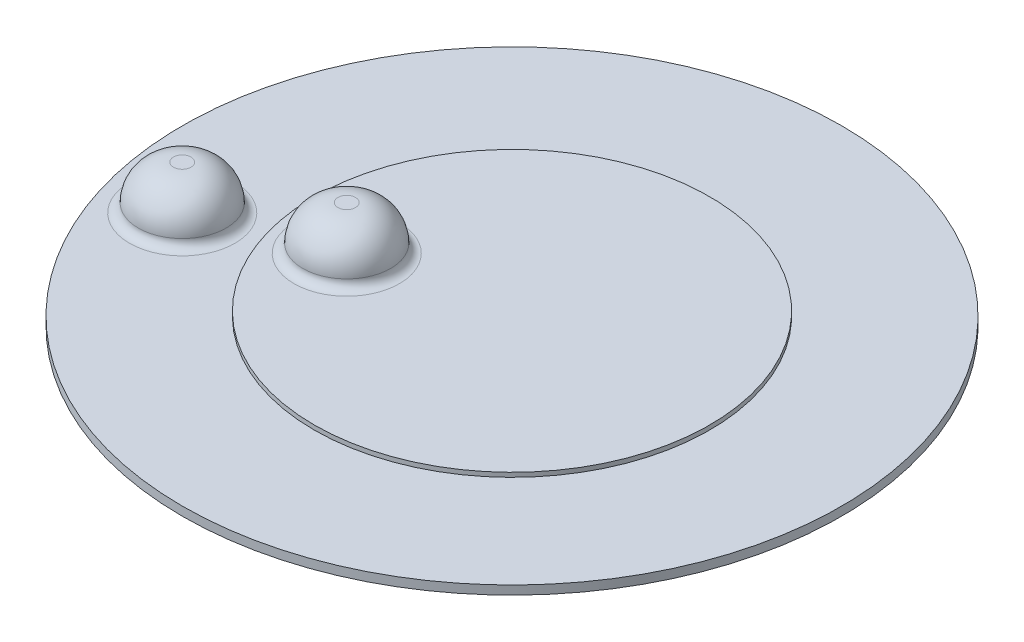
ISO-10303-21;
HEADER;
FILE_DESCRIPTION(('STEP AP214'),'2;1');
FILE_NAME('part.step','',(''),(''),'','','');
FILE_SCHEMA(('AUTOMOTIVE_DESIGN { 1 0 10303 214 1 1 1 1 }'));
ENDSEC;
DATA;
#1=APPLICATION_CONTEXT('core data for automotive mechanical design processes');
#2=APPLICATION_PROTOCOL_DEFINITION('international standard','automotive_design',2000,#1);
#3=PRODUCT_CONTEXT('',#1,'mechanical');
#4=PRODUCT('Part','Part','',(#3));
#5=PRODUCT_RELATED_PRODUCT_CATEGORY('part','',(#4));
#6=PRODUCT_DEFINITION_FORMATION('','',#4);
#7=PRODUCT_DEFINITION_CONTEXT('part definition',#1,'design');
#8=PRODUCT_DEFINITION('design','',#6,#7);
#9=PRODUCT_DEFINITION_SHAPE('','',#8);
#10=(LENGTH_UNIT() NAMED_UNIT(*) SI_UNIT(.MILLI.,.METRE.));
#11=(NAMED_UNIT(*) PLANE_ANGLE_UNIT() SI_UNIT($,.RADIAN.));
#12=(NAMED_UNIT(*) SI_UNIT($,.STERADIAN.) SOLID_ANGLE_UNIT());
#13=UNCERTAINTY_MEASURE_WITH_UNIT(LENGTH_MEASURE(1.E-05),#10,'distance_accuracy_value','');
#14=(GEOMETRIC_REPRESENTATION_CONTEXT(3) GLOBAL_UNCERTAINTY_ASSIGNED_CONTEXT((#13)) GLOBAL_UNIT_ASSIGNED_CONTEXT((#10,
#11,#12)) REPRESENTATION_CONTEXT('',''));
#15=CARTESIAN_POINT('',(0.,0.,0.));
#16=DIRECTION('',(0.,0.,1.));
#17=DIRECTION('',(1.,0.,0.));
#18=AXIS2_PLACEMENT_3D('',#15,#16,#17);
#19=CARTESIAN_POINT('',(0.,0.2,0.));
#20=DIRECTION('',(0.,-1.,0.));
#21=DIRECTION('',(0.,0.,-1.));
#22=AXIS2_PLACEMENT_3D('',#19,#20,#21);
#23=CYLINDRICAL_SURFACE('',#22,7.5);
#24=CARTESIAN_POINT('',(0.,0.2,0.));
#25=DIRECTION('',(0.,1.,0.));
#26=DIRECTION('',(0.,0.,1.));
#27=AXIS2_PLACEMENT_3D('',#24,#25,#26);
#28=CIRCLE('',#27,7.5);
#29=CARTESIAN_POINT('',(0.,0.2,7.5));
#30=VERTEX_POINT('',#29);
#31=EDGE_CURVE('E63',#30,#30,#28,.T.);
#32=ORIENTED_EDGE('',*,*,#31,.F.);
#33=EDGE_LOOP('',(#32));
#34=FACE_BOUND('',#33,.T.);
#35=CARTESIAN_POINT('',(0.,0.,0.));
#36=DIRECTION('',(0.,1.,0.));
#37=DIRECTION('',(0.,0.,1.));
#38=AXIS2_PLACEMENT_3D('',#35,#36,#37);
#39=CIRCLE('',#38,7.5);
#40=CARTESIAN_POINT('',(0.,0.,7.5));
#41=VERTEX_POINT('',#40);
#42=EDGE_CURVE('E60',#41,#41,#39,.T.);
#43=ORIENTED_EDGE('',*,*,#42,.T.);
#44=EDGE_LOOP('',(#43));
#45=FACE_BOUND('',#44,.T.);
#46=ADVANCED_FACE('F33',(#34,#45),#23,.T.);
#47=CARTESIAN_POINT('',(0.,0.2,0.));
#48=DIRECTION('',(0.,1.,0.));
#49=DIRECTION('',(0.,0.,1.));
#50=AXIS2_PLACEMENT_3D('',#47,#48,#49);
#51=PLANE('',#50);
#52=CARTESIAN_POINT('',(-5.78398758039477,0.2,1.72100243956531));
#53=DIRECTION('',(0.,1.,0.));
#54=DIRECTION('',(0.,0.,1.));
#55=AXIS2_PLACEMENT_3D('',#52,#53,#54);
#56=CIRCLE('',#55,1.2);
#57=CARTESIAN_POINT('',(-5.78398758039477,0.2,2.92100243956531));
#58=VERTEX_POINT('',#57);
#59=EDGE_CURVE('E10',#58,#58,#56,.F.);
#60=ORIENTED_EDGE('',*,*,#59,.T.);
#61=EDGE_LOOP('',(#60));
#62=FACE_BOUND('',#61,.T.);
#63=CARTESIAN_POINT('',(0.,0.2,0.));
#64=DIRECTION('',(0.,1.,0.));
#65=DIRECTION('',(0.,0.,1.));
#66=AXIS2_PLACEMENT_3D('',#63,#64,#65);
#67=CIRCLE('',#66,4.5);
#68=CARTESIAN_POINT('',(0.,0.2,4.5));
#69=VERTEX_POINT('',#68);
#70=EDGE_CURVE('E59',#69,#69,#67,.T.);
#71=ORIENTED_EDGE('',*,*,#70,.F.);
#72=EDGE_LOOP('',(#71));
#73=FACE_BOUND('',#72,.T.);
#74=ORIENTED_EDGE('',*,*,#31,.T.);
#75=EDGE_LOOP('',(#74));
#76=FACE_BOUND('',#75,.T.);
#77=ADVANCED_FACE('F81',(#62,#73,#76),#51,.T.);
#78=CARTESIAN_POINT('',(0.,0.,0.));
#79=DIRECTION('',(0.,1.,0.));
#80=DIRECTION('',(0.,0.,1.));
#81=AXIS2_PLACEMENT_3D('',#78,#79,#80);
#82=PLANE('',#81);
#83=ORIENTED_EDGE('',*,*,#42,.F.);
#84=EDGE_LOOP('',(#83));
#85=FACE_BOUND('',#84,.T.);
#86=ADVANCED_FACE('F77',(#85),#82,.F.);
#87=CARTESIAN_POINT('',(0.,0.3,0.));
#88=DIRECTION('',(0.,-1.,0.));
#89=DIRECTION('',(0.,0.,-1.));
#90=AXIS2_PLACEMENT_3D('',#87,#88,#89);
#91=CYLINDRICAL_SURFACE('',#90,4.5);
#92=CARTESIAN_POINT('',(0.,0.3,0.));
#93=DIRECTION('',(0.,1.,0.));
#94=DIRECTION('',(0.,0.,1.));
#95=AXIS2_PLACEMENT_3D('',#92,#93,#94);
#96=CIRCLE('',#95,4.5);
#97=CARTESIAN_POINT('',(0.,0.3,4.5));
#98=VERTEX_POINT('',#97);
#99=EDGE_CURVE('E64',#98,#98,#96,.T.);
#100=ORIENTED_EDGE('',*,*,#99,.F.);
#101=EDGE_LOOP('',(#100));
#102=FACE_BOUND('',#101,.T.);
#103=ORIENTED_EDGE('',*,*,#70,.T.);
#104=EDGE_LOOP('',(#103));
#105=FACE_BOUND('',#104,.T.);
#106=ADVANCED_FACE('F74',(#102,#105),#91,.T.);
#107=CARTESIAN_POINT('',(0.,0.3,0.));
#108=DIRECTION('',(0.,1.,0.));
#109=DIRECTION('',(0.,0.,1.));
#110=AXIS2_PLACEMENT_3D('',#107,#108,#109);
#111=PLANE('',#110);
#112=CARTESIAN_POINT('',(-3.01618984253715,0.3,0.745176314038591));
#113=DIRECTION('',(0.,1.,0.));
#114=DIRECTION('',(0.,0.,1.));
#115=AXIS2_PLACEMENT_3D('',#112,#113,#114);
#116=CIRCLE('',#115,1.2);
#117=CARTESIAN_POINT('',(-3.01618984253715,0.3,1.94517631403859));
#118=VERTEX_POINT('',#117);
#119=EDGE_CURVE('E40',#118,#118,#116,.F.);
#120=ORIENTED_EDGE('',*,*,#119,.T.);
#121=EDGE_LOOP('',(#120));
#122=FACE_BOUND('',#121,.T.);
#123=ORIENTED_EDGE('',*,*,#99,.T.);
#124=EDGE_LOOP('',(#123));
#125=FACE_BOUND('',#124,.T.);
#126=ADVANCED_FACE('F72',(#122,#125),#111,.T.);
#127=CARTESIAN_POINT('',(-5.78398758039477,1.2,1.72100243956531));
#128=DIRECTION('',(0.,1.,0.));
#129=DIRECTION('',(0.,0.,1.));
#130=AXIS2_PLACEMENT_3D('',#127,#128,#129);
#131=PLANE('',#130);
#132=CARTESIAN_POINT('',(-5.78398758039477,1.2,1.72100243956531));
#133=DIRECTION('',(0.,1.,0.));
#134=DIRECTION('',(0.,0.,1.));
#135=AXIS2_PLACEMENT_3D('',#132,#133,#134);
#136=CIRCLE('',#135,0.2);
#137=CARTESIAN_POINT('',(-5.78398758039477,1.2,1.92100243956531));
#138=VERTEX_POINT('',#137);
#139=EDGE_CURVE('E56',#138,#138,#136,.T.);
#140=ORIENTED_EDGE('',*,*,#139,.T.);
#141=EDGE_LOOP('',(#140));
#142=FACE_BOUND('',#141,.T.);
#143=ADVANCED_FACE('F101',(#142),#131,.T.);
#144=CARTESIAN_POINT('',(-5.78398758039477,0.4,1.72100243956531));
#145=DIRECTION('',(0.,1.,0.));
#146=DIRECTION('',(0.,0.,1.));
#147=AXIS2_PLACEMENT_3D('',#144,#145,#146);
#148=DEGENERATE_TOROIDAL_SURFACE('',#147,0.2,0.8,.T.);
#149=CARTESIAN_POINT('',(-5.78398758039477,0.4,1.72100243956531));
#150=DIRECTION('',(0.,1.,0.));
#151=DIRECTION('',(0.,0.,1.));
#152=AXIS2_PLACEMENT_3D('',#149,#150,#151);
#153=CIRCLE('',#152,1.);
#154=CARTESIAN_POINT('',(-5.78398758039477,0.4,2.72100243956531));
#155=VERTEX_POINT('',#154);
#156=EDGE_CURVE('E53',#155,#155,#153,.F.);
#157=ORIENTED_EDGE('',*,*,#156,.F.);
#158=EDGE_LOOP('',(#157));
#159=FACE_BOUND('',#158,.T.);
#160=ORIENTED_EDGE('',*,*,#139,.F.);
#161=EDGE_LOOP('',(#160));
#162=FACE_BOUND('',#161,.T.);
#163=ADVANCED_FACE('F97',(#159,#162),#148,.T.);
#164=CARTESIAN_POINT('',(-3.01618984253715,1.3,0.745176314038591));
#165=DIRECTION('',(0.,1.,0.));
#166=DIRECTION('',(0.,0.,1.));
#167=AXIS2_PLACEMENT_3D('',#164,#165,#166);
#168=PLANE('',#167);
#169=CARTESIAN_POINT('',(-3.01618984253715,1.3,0.745176314038591));
#170=DIRECTION('',(0.,1.,0.));
#171=DIRECTION('',(0.,0.,1.));
#172=AXIS2_PLACEMENT_3D('',#169,#170,#171);
#173=CIRCLE('',#172,0.2);
#174=CARTESIAN_POINT('',(-3.01618984253715,1.3,0.945176314038591));
#175=VERTEX_POINT('',#174);
#176=EDGE_CURVE('E48',#175,#175,#173,.T.);
#177=ORIENTED_EDGE('',*,*,#176,.T.);
#178=EDGE_LOOP('',(#177));
#179=FACE_BOUND('',#178,.T.);
#180=ADVANCED_FACE('F100',(#179),#168,.T.);
#181=CARTESIAN_POINT('',(-3.01618984253715,0.5,0.745176314038591));
#182=DIRECTION('',(0.,1.,0.));
#183=DIRECTION('',(0.,0.,1.));
#184=AXIS2_PLACEMENT_3D('',#181,#182,#183);
#185=DEGENERATE_TOROIDAL_SURFACE('',#184,0.2,0.8,.T.);
#186=CARTESIAN_POINT('',(-3.01618984253715,0.5,0.745176314038591));
#187=DIRECTION('',(0.,1.,0.));
#188=DIRECTION('',(0.,0.,1.));
#189=AXIS2_PLACEMENT_3D('',#186,#187,#188);
#190=CIRCLE('',#189,1.);
#191=CARTESIAN_POINT('',(-3.01618984253715,0.5,1.74517631403859));
#192=VERTEX_POINT('',#191);
#193=EDGE_CURVE('E44',#192,#192,#190,.F.);
#194=ORIENTED_EDGE('',*,*,#193,.F.);
#195=EDGE_LOOP('',(#194));
#196=FACE_BOUND('',#195,.T.);
#197=ORIENTED_EDGE('',*,*,#176,.F.);
#198=EDGE_LOOP('',(#197));
#199=FACE_BOUND('',#198,.T.);
#200=ADVANCED_FACE('F103',(#196,#199),#185,.T.);
#201=CARTESIAN_POINT('',(-3.01618984253715,0.5,0.745176314038591));
#202=DIRECTION('',(0.,1.,0.));
#203=DIRECTION('',(0.,0.,1.));
#204=AXIS2_PLACEMENT_3D('',#201,#202,#203);
#205=TOROIDAL_SURFACE('',#204,1.2,0.2);
#206=ORIENTED_EDGE('',*,*,#119,.F.);
#207=EDGE_LOOP('',(#206));
#208=FACE_BOUND('',#207,.T.);
#209=ORIENTED_EDGE('',*,*,#193,.T.);
#210=EDGE_LOOP('',(#209));
#211=FACE_BOUND('',#210,.T.);
#212=ADVANCED_FACE('F105',(#208,#211),#205,.F.);
#213=CARTESIAN_POINT('',(-5.78398758039477,0.4,1.72100243956531));
#214=DIRECTION('',(0.,1.,0.));
#215=DIRECTION('',(0.,0.,1.));
#216=AXIS2_PLACEMENT_3D('',#213,#214,#215);
#217=TOROIDAL_SURFACE('',#216,1.2,0.2);
#218=ORIENTED_EDGE('',*,*,#59,.F.);
#219=EDGE_LOOP('',(#218));
#220=FACE_BOUND('',#219,.T.);
#221=ORIENTED_EDGE('',*,*,#156,.T.);
#222=EDGE_LOOP('',(#221));
#223=FACE_BOUND('',#222,.T.);
#224=ADVANCED_FACE('F35',(#220,#223),#217,.F.);
#225=CLOSED_SHELL('',(#46,#77,#86,#106,#126,#143,#163,#180,#200,#212,#224));
#226=MANIFOLD_SOLID_BREP('B2',#225);
#227=ADVANCED_BREP_SHAPE_REPRESENTATION('',(#18,#226),#14);
#228=SHAPE_DEFINITION_REPRESENTATION(#9,#227);
ENDSEC;
END-ISO-10303-21;
